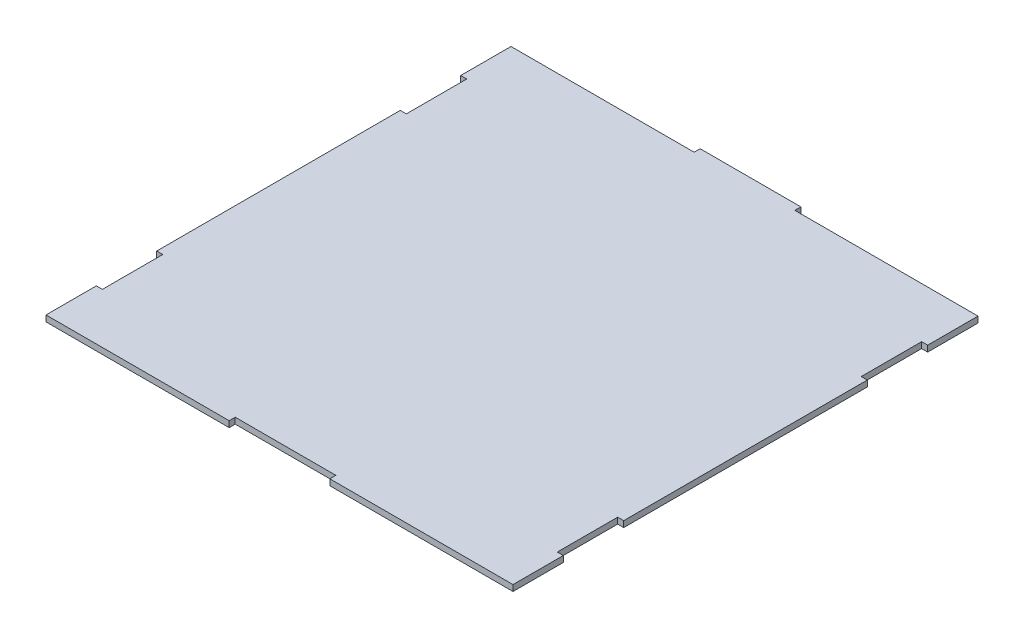
ISO-10303-21;
HEADER;
FILE_DESCRIPTION(('STEP AP214'),'2;1');
FILE_NAME('part.step','',(''),(''),'','','');
FILE_SCHEMA(('AUTOMOTIVE_DESIGN { 1 0 10303 214 1 1 1 1 }'));
ENDSEC;
DATA;
#1=APPLICATION_CONTEXT('core data for automotive mechanical design processes');
#2=APPLICATION_PROTOCOL_DEFINITION('international standard','automotive_design',2000,#1);
#3=PRODUCT_CONTEXT('',#1,'mechanical');
#4=PRODUCT('Part','Part','',(#3));
#5=PRODUCT_RELATED_PRODUCT_CATEGORY('part','',(#4));
#6=PRODUCT_DEFINITION_FORMATION('','',#4);
#7=PRODUCT_DEFINITION_CONTEXT('part definition',#1,'design');
#8=PRODUCT_DEFINITION('design','',#6,#7);
#9=PRODUCT_DEFINITION_SHAPE('','',#8);
#10=(LENGTH_UNIT() NAMED_UNIT(*) SI_UNIT(.MILLI.,.METRE.));
#11=(NAMED_UNIT(*) PLANE_ANGLE_UNIT() SI_UNIT($,.RADIAN.));
#12=(NAMED_UNIT(*) SI_UNIT($,.STERADIAN.) SOLID_ANGLE_UNIT());
#13=UNCERTAINTY_MEASURE_WITH_UNIT(LENGTH_MEASURE(1.E-05),#10,'distance_accuracy_value','');
#14=(GEOMETRIC_REPRESENTATION_CONTEXT(3) GLOBAL_UNCERTAINTY_ASSIGNED_CONTEXT((#13)) GLOBAL_UNIT_ASSIGNED_CONTEXT((#10,
#11,#12)) REPRESENTATION_CONTEXT('',''));
#15=CARTESIAN_POINT('',(0.,0.,0.));
#16=DIRECTION('',(0.,0.,1.));
#17=DIRECTION('',(1.,0.,0.));
#18=AXIS2_PLACEMENT_3D('',#15,#16,#17);
#19=CARTESIAN_POINT('',(91.0000000000001,3.,0.));
#20=DIRECTION('',(0.,0.,-1.));
#21=DIRECTION('',(-1.,0.,0.));
#22=AXIS2_PLACEMENT_3D('',#19,#20,#21);
#23=PLANE('',#22);
#24=DIRECTION('',(1.,0.,0.));
#25=VECTOR('',#24,1.);
#26=CARTESIAN_POINT('',(91.0000000000001,0.,0.));
#27=LINE('',#26,#25);
#28=CARTESIAN_POINT('',(0.,0.,0.));
#29=VERTEX_POINT('',#28);
#30=CARTESIAN_POINT('',(91.0000000000001,0.,0.));
#31=VERTEX_POINT('',#30);
#32=EDGE_CURVE('E260',#29,#31,#27,.T.);
#33=ORIENTED_EDGE('',*,*,#32,.T.);
#34=DIRECTION('',(0.,-1.,0.));
#35=VECTOR('',#34,1.);
#36=CARTESIAN_POINT('',(91.0000000000001,3.,0.));
#37=LINE('',#36,#35);
#38=CARTESIAN_POINT('',(91.0000000000001,3.,0.));
#39=VERTEX_POINT('',#38);
#40=EDGE_CURVE('E11',#39,#31,#37,.T.);
#41=ORIENTED_EDGE('',*,*,#40,.F.);
#42=DIRECTION('',(1.,0.,0.));
#43=VECTOR('',#42,1.);
#44=CARTESIAN_POINT('',(91.0000000000001,3.,0.));
#45=LINE('',#44,#43);
#46=CARTESIAN_POINT('',(0.,3.,0.));
#47=VERTEX_POINT('',#46);
#48=EDGE_CURVE('E342',#47,#39,#45,.T.);
#49=ORIENTED_EDGE('',*,*,#48,.F.);
#50=DIRECTION('',(0.,-1.,0.));
#51=VECTOR('',#50,1.);
#52=CARTESIAN_POINT('',(0.,3.,0.));
#53=LINE('',#52,#51);
#54=EDGE_CURVE('E256',#47,#29,#53,.T.);
#55=ORIENTED_EDGE('',*,*,#54,.T.);
#56=EDGE_LOOP('',(#33,#41,#49,#55));
#57=FACE_BOUND('',#56,.T.);
#58=ADVANCED_FACE('F39',(#57),#23,.F.);
#59=CARTESIAN_POINT('',(91.0000000000001,3.,-3.));
#60=DIRECTION('',(-1.,0.,0.));
#61=DIRECTION('',(0.,0.,1.));
#62=AXIS2_PLACEMENT_3D('',#59,#60,#61);
#63=PLANE('',#62);
#64=DIRECTION('',(0.,0.,-1.));
#65=VECTOR('',#64,1.);
#66=CARTESIAN_POINT('',(91.0000000000001,0.,-3.));
#67=LINE('',#66,#65);
#68=CARTESIAN_POINT('',(91.0000000000001,0.,-3.));
#69=VERTEX_POINT('',#68);
#70=EDGE_CURVE('E264',#31,#69,#67,.T.);
#71=ORIENTED_EDGE('',*,*,#70,.T.);
#72=DIRECTION('',(0.,-1.,0.));
#73=VECTOR('',#72,1.);
#74=CARTESIAN_POINT('',(91.0000000000001,3.,-3.));
#75=LINE('',#74,#73);
#76=CARTESIAN_POINT('',(91.0000000000001,3.,-3.));
#77=VERTEX_POINT('',#76);
#78=EDGE_CURVE('E48',#77,#69,#75,.T.);
#79=ORIENTED_EDGE('',*,*,#78,.F.);
#80=DIRECTION('',(0.,0.,-1.));
#81=VECTOR('',#80,1.);
#82=CARTESIAN_POINT('',(91.0000000000001,3.,-3.));
#83=LINE('',#82,#81);
#84=EDGE_CURVE('E159',#39,#77,#83,.T.);
#85=ORIENTED_EDGE('',*,*,#84,.F.);
#86=ORIENTED_EDGE('',*,*,#40,.T.);
#87=EDGE_LOOP('',(#71,#79,#85,#86));
#88=FACE_BOUND('',#87,.T.);
#89=ADVANCED_FACE('F548',(#88),#63,.F.);
#90=CARTESIAN_POINT('',(141.,3.,-3.));
#91=DIRECTION('',(0.,0.,-1.));
#92=DIRECTION('',(-1.,0.,0.));
#93=AXIS2_PLACEMENT_3D('',#90,#91,#92);
#94=PLANE('',#93);
#95=DIRECTION('',(1.,0.,0.));
#96=VECTOR('',#95,1.);
#97=CARTESIAN_POINT('',(141.,0.,-3.));
#98=LINE('',#97,#96);
#99=CARTESIAN_POINT('',(141.,0.,-3.));
#100=VERTEX_POINT('',#99);
#101=EDGE_CURVE('E267',#69,#100,#98,.T.);
#102=ORIENTED_EDGE('',*,*,#101,.T.);
#103=DIRECTION('',(0.,-1.,0.));
#104=VECTOR('',#103,1.);
#105=CARTESIAN_POINT('',(141.,3.,-3.));
#106=LINE('',#105,#104);
#107=CARTESIAN_POINT('',(141.,3.,-3.));
#108=VERTEX_POINT('',#107);
#109=EDGE_CURVE('E433',#108,#100,#106,.T.);
#110=ORIENTED_EDGE('',*,*,#109,.F.);
#111=DIRECTION('',(1.,0.,0.));
#112=VECTOR('',#111,1.);
#113=CARTESIAN_POINT('',(141.,3.,-3.));
#114=LINE('',#113,#112);
#115=EDGE_CURVE('E443',#77,#108,#114,.T.);
#116=ORIENTED_EDGE('',*,*,#115,.F.);
#117=ORIENTED_EDGE('',*,*,#78,.T.);
#118=EDGE_LOOP('',(#102,#110,#116,#117));
#119=FACE_BOUND('',#118,.T.);
#120=ADVANCED_FACE('F441',(#119),#94,.F.);
#121=CARTESIAN_POINT('',(141.,3.,0.));
#122=DIRECTION('',(1.,0.,0.));
#123=DIRECTION('',(0.,0.,-1.));
#124=AXIS2_PLACEMENT_3D('',#121,#122,#123);
#125=PLANE('',#124);
#126=DIRECTION('',(0.,0.,1.));
#127=VECTOR('',#126,1.);
#128=CARTESIAN_POINT('',(141.,0.,0.));
#129=LINE('',#128,#127);
#130=CARTESIAN_POINT('',(141.,0.,0.));
#131=VERTEX_POINT('',#130);
#132=EDGE_CURVE('E270',#100,#131,#129,.T.);
#133=ORIENTED_EDGE('',*,*,#132,.T.);
#134=DIRECTION('',(0.,-1.,0.));
#135=VECTOR('',#134,1.);
#136=CARTESIAN_POINT('',(141.,3.,0.));
#137=LINE('',#136,#135);
#138=CARTESIAN_POINT('',(141.,3.,0.));
#139=VERTEX_POINT('',#138);
#140=EDGE_CURVE('E429',#139,#131,#137,.T.);
#141=ORIENTED_EDGE('',*,*,#140,.F.);
#142=DIRECTION('',(0.,0.,1.));
#143=VECTOR('',#142,1.);
#144=CARTESIAN_POINT('',(141.,3.,0.));
#145=LINE('',#144,#143);
#146=EDGE_CURVE('E462',#108,#139,#145,.T.);
#147=ORIENTED_EDGE('',*,*,#146,.F.);
#148=ORIENTED_EDGE('',*,*,#109,.T.);
#149=EDGE_LOOP('',(#133,#141,#147,#148));
#150=FACE_BOUND('',#149,.T.);
#151=ADVANCED_FACE('F452',(#150),#125,.F.);
#152=CARTESIAN_POINT('',(232.,3.,0.));
#153=DIRECTION('',(0.,0.,-1.));
#154=DIRECTION('',(-1.,0.,0.));
#155=AXIS2_PLACEMENT_3D('',#152,#153,#154);
#156=PLANE('',#155);
#157=DIRECTION('',(1.,0.,0.));
#158=VECTOR('',#157,1.);
#159=CARTESIAN_POINT('',(232.,0.,0.));
#160=LINE('',#159,#158);
#161=CARTESIAN_POINT('',(232.,0.,0.));
#162=VERTEX_POINT('',#161);
#163=EDGE_CURVE('E273',#131,#162,#160,.T.);
#164=ORIENTED_EDGE('',*,*,#163,.T.);
#165=DIRECTION('',(0.,-1.,0.));
#166=VECTOR('',#165,1.);
#167=CARTESIAN_POINT('',(232.,3.,0.));
#168=LINE('',#167,#166);
#169=CARTESIAN_POINT('',(232.,3.,0.));
#170=VERTEX_POINT('',#169);
#171=EDGE_CURVE('E425',#170,#162,#168,.T.);
#172=ORIENTED_EDGE('',*,*,#171,.F.);
#173=DIRECTION('',(1.,0.,0.));
#174=VECTOR('',#173,1.);
#175=CARTESIAN_POINT('',(232.,3.,0.));
#176=LINE('',#175,#174);
#177=EDGE_CURVE('E458',#139,#170,#176,.T.);
#178=ORIENTED_EDGE('',*,*,#177,.F.);
#179=ORIENTED_EDGE('',*,*,#140,.T.);
#180=EDGE_LOOP('',(#164,#172,#178,#179));
#181=FACE_BOUND('',#180,.T.);
#182=ADVANCED_FACE('F456',(#181),#156,.F.);
#183=CARTESIAN_POINT('',(232.,3.,-25.));
#184=DIRECTION('',(-1.,0.,0.));
#185=DIRECTION('',(0.,0.,1.));
#186=AXIS2_PLACEMENT_3D('',#183,#184,#185);
#187=PLANE('',#186);
#188=DIRECTION('',(0.,0.,-1.));
#189=VECTOR('',#188,1.);
#190=CARTESIAN_POINT('',(232.,0.,-25.));
#191=LINE('',#190,#189);
#192=CARTESIAN_POINT('',(232.,0.,-25.));
#193=VERTEX_POINT('',#192);
#194=EDGE_CURVE('E276',#162,#193,#191,.T.);
#195=ORIENTED_EDGE('',*,*,#194,.T.);
#196=DIRECTION('',(0.,-1.,0.));
#197=VECTOR('',#196,1.);
#198=CARTESIAN_POINT('',(232.,3.,-25.));
#199=LINE('',#198,#197);
#200=CARTESIAN_POINT('',(232.,3.,-25.));
#201=VERTEX_POINT('',#200);
#202=EDGE_CURVE('E421',#201,#193,#199,.T.);
#203=ORIENTED_EDGE('',*,*,#202,.F.);
#204=DIRECTION('',(0.,0.,-1.));
#205=VECTOR('',#204,1.);
#206=CARTESIAN_POINT('',(232.,3.,-25.));
#207=LINE('',#206,#205);
#208=EDGE_CURVE('E461',#170,#201,#207,.T.);
#209=ORIENTED_EDGE('',*,*,#208,.F.);
#210=ORIENTED_EDGE('',*,*,#171,.T.);
#211=EDGE_LOOP('',(#195,#203,#209,#210));
#212=FACE_BOUND('',#211,.T.);
#213=ADVANCED_FACE('F561',(#212),#187,.F.);
#214=CARTESIAN_POINT('',(232.,3.,-25.));
#215=DIRECTION('',(0.,0.,1.));
#216=DIRECTION('',(1.,0.,0.));
#217=AXIS2_PLACEMENT_3D('',#214,#215,#216);
#218=PLANE('',#217);
#219=DIRECTION('',(-1.,0.,0.));
#220=VECTOR('',#219,1.);
#221=CARTESIAN_POINT('',(232.,0.,-25.));
#222=LINE('',#221,#220);
#223=CARTESIAN_POINT('',(229.,0.,-25.));
#224=VERTEX_POINT('',#223);
#225=EDGE_CURVE('E279',#193,#224,#222,.T.);
#226=ORIENTED_EDGE('',*,*,#225,.T.);
#227=DIRECTION('',(0.,-1.,0.));
#228=VECTOR('',#227,1.);
#229=CARTESIAN_POINT('',(229.,3.,-25.));
#230=LINE('',#229,#228);
#231=CARTESIAN_POINT('',(229.,3.,-25.));
#232=VERTEX_POINT('',#231);
#233=EDGE_CURVE('E417',#232,#224,#230,.T.);
#234=ORIENTED_EDGE('',*,*,#233,.F.);
#235=DIRECTION('',(-1.,0.,0.));
#236=VECTOR('',#235,1.);
#237=CARTESIAN_POINT('',(232.,3.,-25.));
#238=LINE('',#237,#236);
#239=EDGE_CURVE('E466',#201,#232,#238,.T.);
#240=ORIENTED_EDGE('',*,*,#239,.F.);
#241=ORIENTED_EDGE('',*,*,#202,.T.);
#242=EDGE_LOOP('',(#226,#234,#240,#241));
#243=FACE_BOUND('',#242,.T.);
#244=ADVANCED_FACE('F564',(#243),#218,.F.);
#245=CARTESIAN_POINT('',(229.,3.,-25.));
#246=DIRECTION('',(-1.,0.,0.));
#247=DIRECTION('',(0.,0.,1.));
#248=AXIS2_PLACEMENT_3D('',#245,#246,#247);
#249=PLANE('',#248);
#250=DIRECTION('',(0.,0.,-1.));
#251=VECTOR('',#250,1.);
#252=CARTESIAN_POINT('',(229.,0.,-25.));
#253=LINE('',#252,#251);
#254=CARTESIAN_POINT('',(229.,0.,-55.));
#255=VERTEX_POINT('',#254);
#256=EDGE_CURVE('E282',#224,#255,#253,.T.);
#257=ORIENTED_EDGE('',*,*,#256,.T.);
#258=DIRECTION('',(0.,-1.,0.));
#259=VECTOR('',#258,1.);
#260=CARTESIAN_POINT('',(229.,3.,-55.));
#261=LINE('',#260,#259);
#262=CARTESIAN_POINT('',(229.,3.,-55.));
#263=VERTEX_POINT('',#262);
#264=EDGE_CURVE('E413',#263,#255,#261,.T.);
#265=ORIENTED_EDGE('',*,*,#264,.F.);
#266=DIRECTION('',(0.,0.,-1.));
#267=VECTOR('',#266,1.);
#268=CARTESIAN_POINT('',(229.,3.,-25.));
#269=LINE('',#268,#267);
#270=EDGE_CURVE('E473',#232,#263,#269,.T.);
#271=ORIENTED_EDGE('',*,*,#270,.F.);
#272=ORIENTED_EDGE('',*,*,#233,.T.);
#273=EDGE_LOOP('',(#257,#265,#271,#272));
#274=FACE_BOUND('',#273,.T.);
#275=ADVANCED_FACE('F568',(#274),#249,.F.);
#276=CARTESIAN_POINT('',(232.,3.,-55.));
#277=DIRECTION('',(0.,0.,-1.));
#278=DIRECTION('',(-1.,0.,0.));
#279=AXIS2_PLACEMENT_3D('',#276,#277,#278);
#280=PLANE('',#279);
#281=DIRECTION('',(1.,0.,0.));
#282=VECTOR('',#281,1.);
#283=CARTESIAN_POINT('',(232.,0.,-55.));
#284=LINE('',#283,#282);
#285=CARTESIAN_POINT('',(232.,0.,-55.));
#286=VERTEX_POINT('',#285);
#287=EDGE_CURVE('E285',#255,#286,#284,.T.);
#288=ORIENTED_EDGE('',*,*,#287,.T.);
#289=DIRECTION('',(0.,-1.,0.));
#290=VECTOR('',#289,1.);
#291=CARTESIAN_POINT('',(232.,3.,-55.));
#292=LINE('',#291,#290);
#293=CARTESIAN_POINT('',(232.,3.,-55.));
#294=VERTEX_POINT('',#293);
#295=EDGE_CURVE('E409',#294,#286,#292,.T.);
#296=ORIENTED_EDGE('',*,*,#295,.F.);
#297=DIRECTION('',(1.,0.,0.));
#298=VECTOR('',#297,1.);
#299=CARTESIAN_POINT('',(232.,3.,-55.));
#300=LINE('',#299,#298);
#301=EDGE_CURVE('E476',#263,#294,#300,.T.);
#302=ORIENTED_EDGE('',*,*,#301,.F.);
#303=ORIENTED_EDGE('',*,*,#264,.T.);
#304=EDGE_LOOP('',(#288,#296,#302,#303));
#305=FACE_BOUND('',#304,.T.);
#306=ADVANCED_FACE('F572',(#305),#280,.F.);
#307=CARTESIAN_POINT('',(232.,3.,-176.));
#308=DIRECTION('',(-1.,0.,0.));
#309=DIRECTION('',(0.,0.,1.));
#310=AXIS2_PLACEMENT_3D('',#307,#308,#309);
#311=PLANE('',#310);
#312=DIRECTION('',(0.,0.,-1.));
#313=VECTOR('',#312,1.);
#314=CARTESIAN_POINT('',(232.,0.,-176.));
#315=LINE('',#314,#313);
#316=CARTESIAN_POINT('',(232.,0.,-176.));
#317=VERTEX_POINT('',#316);
#318=EDGE_CURVE('E288',#286,#317,#315,.T.);
#319=ORIENTED_EDGE('',*,*,#318,.T.);
#320=DIRECTION('',(0.,-1.,0.));
#321=VECTOR('',#320,1.);
#322=CARTESIAN_POINT('',(232.,3.,-176.));
#323=LINE('',#322,#321);
#324=CARTESIAN_POINT('',(232.,3.,-176.));
#325=VERTEX_POINT('',#324);
#326=EDGE_CURVE('E405',#325,#317,#323,.T.);
#327=ORIENTED_EDGE('',*,*,#326,.F.);
#328=DIRECTION('',(0.,0.,-1.));
#329=VECTOR('',#328,1.);
#330=CARTESIAN_POINT('',(232.,3.,-176.));
#331=LINE('',#330,#329);
#332=EDGE_CURVE('E479',#294,#325,#331,.T.);
#333=ORIENTED_EDGE('',*,*,#332,.F.);
#334=ORIENTED_EDGE('',*,*,#295,.T.);
#335=EDGE_LOOP('',(#319,#327,#333,#334));
#336=FACE_BOUND('',#335,.T.);
#337=ADVANCED_FACE('F576',(#336),#311,.F.);
#338=CARTESIAN_POINT('',(232.,3.,-176.));
#339=DIRECTION('',(0.,0.,1.));
#340=DIRECTION('',(1.,0.,0.));
#341=AXIS2_PLACEMENT_3D('',#338,#339,#340);
#342=PLANE('',#341);
#343=DIRECTION('',(-1.,0.,0.));
#344=VECTOR('',#343,1.);
#345=CARTESIAN_POINT('',(232.,0.,-176.));
#346=LINE('',#345,#344);
#347=CARTESIAN_POINT('',(229.,0.,-176.));
#348=VERTEX_POINT('',#347);
#349=EDGE_CURVE('E291',#317,#348,#346,.T.);
#350=ORIENTED_EDGE('',*,*,#349,.T.);
#351=DIRECTION('',(0.,-1.,0.));
#352=VECTOR('',#351,1.);
#353=CARTESIAN_POINT('',(229.,3.,-176.));
#354=LINE('',#353,#352);
#355=CARTESIAN_POINT('',(229.,3.,-176.));
#356=VERTEX_POINT('',#355);
#357=EDGE_CURVE('E401',#356,#348,#354,.T.);
#358=ORIENTED_EDGE('',*,*,#357,.F.);
#359=DIRECTION('',(-1.,0.,0.));
#360=VECTOR('',#359,1.);
#361=CARTESIAN_POINT('',(232.,3.,-176.));
#362=LINE('',#361,#360);
#363=EDGE_CURVE('E482',#325,#356,#362,.T.);
#364=ORIENTED_EDGE('',*,*,#363,.F.);
#365=ORIENTED_EDGE('',*,*,#326,.T.);
#366=EDGE_LOOP('',(#350,#358,#364,#365));
#367=FACE_BOUND('',#366,.T.);
#368=ADVANCED_FACE('F580',(#367),#342,.F.);
#369=CARTESIAN_POINT('',(229.,3.,-176.));
#370=DIRECTION('',(-1.,0.,0.));
#371=DIRECTION('',(0.,0.,1.));
#372=AXIS2_PLACEMENT_3D('',#369,#370,#371);
#373=PLANE('',#372);
#374=DIRECTION('',(0.,0.,-1.));
#375=VECTOR('',#374,1.);
#376=CARTESIAN_POINT('',(229.,0.,-176.));
#377=LINE('',#376,#375);
#378=CARTESIAN_POINT('',(229.,0.,-206.));
#379=VERTEX_POINT('',#378);
#380=EDGE_CURVE('E294',#348,#379,#377,.T.);
#381=ORIENTED_EDGE('',*,*,#380,.T.);
#382=DIRECTION('',(0.,-1.,0.));
#383=VECTOR('',#382,1.);
#384=CARTESIAN_POINT('',(229.,3.,-206.));
#385=LINE('',#384,#383);
#386=CARTESIAN_POINT('',(229.,3.,-206.));
#387=VERTEX_POINT('',#386);
#388=EDGE_CURVE('E397',#387,#379,#385,.T.);
#389=ORIENTED_EDGE('',*,*,#388,.F.);
#390=DIRECTION('',(0.,0.,-1.));
#391=VECTOR('',#390,1.);
#392=CARTESIAN_POINT('',(229.,3.,-176.));
#393=LINE('',#392,#391);
#394=EDGE_CURVE('E485',#356,#387,#393,.T.);
#395=ORIENTED_EDGE('',*,*,#394,.F.);
#396=ORIENTED_EDGE('',*,*,#357,.T.);
#397=EDGE_LOOP('',(#381,#389,#395,#396));
#398=FACE_BOUND('',#397,.T.);
#399=ADVANCED_FACE('F584',(#398),#373,.F.);
#400=CARTESIAN_POINT('',(232.,3.,-206.));
#401=DIRECTION('',(0.,0.,-1.));
#402=DIRECTION('',(-1.,0.,0.));
#403=AXIS2_PLACEMENT_3D('',#400,#401,#402);
#404=PLANE('',#403);
#405=DIRECTION('',(1.,0.,0.));
#406=VECTOR('',#405,1.);
#407=CARTESIAN_POINT('',(232.,0.,-206.));
#408=LINE('',#407,#406);
#409=CARTESIAN_POINT('',(232.,0.,-206.));
#410=VERTEX_POINT('',#409);
#411=EDGE_CURVE('E297',#379,#410,#408,.T.);
#412=ORIENTED_EDGE('',*,*,#411,.T.);
#413=DIRECTION('',(0.,-1.,0.));
#414=VECTOR('',#413,1.);
#415=CARTESIAN_POINT('',(232.,3.,-206.));
#416=LINE('',#415,#414);
#417=CARTESIAN_POINT('',(232.,3.,-206.));
#418=VERTEX_POINT('',#417);
#419=EDGE_CURVE('E393',#418,#410,#416,.T.);
#420=ORIENTED_EDGE('',*,*,#419,.F.);
#421=DIRECTION('',(1.,0.,0.));
#422=VECTOR('',#421,1.);
#423=CARTESIAN_POINT('',(232.,3.,-206.));
#424=LINE('',#423,#422);
#425=EDGE_CURVE('E488',#387,#418,#424,.T.);
#426=ORIENTED_EDGE('',*,*,#425,.F.);
#427=ORIENTED_EDGE('',*,*,#388,.T.);
#428=EDGE_LOOP('',(#412,#420,#426,#427));
#429=FACE_BOUND('',#428,.T.);
#430=ADVANCED_FACE('F588',(#429),#404,.F.);
#431=CARTESIAN_POINT('',(232.,3.,-231.));
#432=DIRECTION('',(-1.,0.,0.));
#433=DIRECTION('',(0.,0.,1.));
#434=AXIS2_PLACEMENT_3D('',#431,#432,#433);
#435=PLANE('',#434);
#436=DIRECTION('',(0.,0.,-1.));
#437=VECTOR('',#436,1.);
#438=CARTESIAN_POINT('',(232.,0.,-231.));
#439=LINE('',#438,#437);
#440=CARTESIAN_POINT('',(232.,0.,-231.));
#441=VERTEX_POINT('',#440);
#442=EDGE_CURVE('E300',#410,#441,#439,.T.);
#443=ORIENTED_EDGE('',*,*,#442,.T.);
#444=DIRECTION('',(0.,-1.,0.));
#445=VECTOR('',#444,1.);
#446=CARTESIAN_POINT('',(232.,3.,-231.));
#447=LINE('',#446,#445);
#448=CARTESIAN_POINT('',(232.,3.,-231.));
#449=VERTEX_POINT('',#448);
#450=EDGE_CURVE('E389',#449,#441,#447,.T.);
#451=ORIENTED_EDGE('',*,*,#450,.F.);
#452=DIRECTION('',(0.,0.,-1.));
#453=VECTOR('',#452,1.);
#454=CARTESIAN_POINT('',(232.,3.,-231.));
#455=LINE('',#454,#453);
#456=EDGE_CURVE('E491',#418,#449,#455,.T.);
#457=ORIENTED_EDGE('',*,*,#456,.F.);
#458=ORIENTED_EDGE('',*,*,#419,.T.);
#459=EDGE_LOOP('',(#443,#451,#457,#458));
#460=FACE_BOUND('',#459,.T.);
#461=ADVANCED_FACE('F592',(#460),#435,.F.);
#462=CARTESIAN_POINT('',(141.,3.,-231.));
#463=DIRECTION('',(0.,0.,1.));
#464=DIRECTION('',(1.,0.,0.));
#465=AXIS2_PLACEMENT_3D('',#462,#463,#464);
#466=PLANE('',#465);
#467=DIRECTION('',(-1.,0.,0.));
#468=VECTOR('',#467,1.);
#469=CARTESIAN_POINT('',(141.,0.,-231.));
#470=LINE('',#469,#468);
#471=CARTESIAN_POINT('',(141.,0.,-231.));
#472=VERTEX_POINT('',#471);
#473=EDGE_CURVE('E303',#441,#472,#470,.T.);
#474=ORIENTED_EDGE('',*,*,#473,.T.);
#475=DIRECTION('',(0.,-1.,0.));
#476=VECTOR('',#475,1.);
#477=CARTESIAN_POINT('',(141.,3.,-231.));
#478=LINE('',#477,#476);
#479=CARTESIAN_POINT('',(141.,3.,-231.));
#480=VERTEX_POINT('',#479);
#481=EDGE_CURVE('E385',#480,#472,#478,.T.);
#482=ORIENTED_EDGE('',*,*,#481,.F.);
#483=DIRECTION('',(-1.,0.,0.));
#484=VECTOR('',#483,1.);
#485=CARTESIAN_POINT('',(141.,3.,-231.));
#486=LINE('',#485,#484);
#487=EDGE_CURVE('E494',#449,#480,#486,.T.);
#488=ORIENTED_EDGE('',*,*,#487,.F.);
#489=ORIENTED_EDGE('',*,*,#450,.T.);
#490=EDGE_LOOP('',(#474,#482,#488,#489));
#491=FACE_BOUND('',#490,.T.);
#492=ADVANCED_FACE('F596',(#491),#466,.F.);
#493=CARTESIAN_POINT('',(141.,3.,-234.));
#494=DIRECTION('',(-1.,0.,0.));
#495=DIRECTION('',(0.,0.,1.));
#496=AXIS2_PLACEMENT_3D('',#493,#494,#495);
#497=PLANE('',#496);
#498=DIRECTION('',(0.,0.,-1.));
#499=VECTOR('',#498,1.);
#500=CARTESIAN_POINT('',(141.,0.,-234.));
#501=LINE('',#500,#499);
#502=CARTESIAN_POINT('',(141.,0.,-234.));
#503=VERTEX_POINT('',#502);
#504=EDGE_CURVE('E306',#472,#503,#501,.T.);
#505=ORIENTED_EDGE('',*,*,#504,.T.);
#506=DIRECTION('',(0.,-1.,0.));
#507=VECTOR('',#506,1.);
#508=CARTESIAN_POINT('',(141.,3.,-234.));
#509=LINE('',#508,#507);
#510=CARTESIAN_POINT('',(141.,3.,-234.));
#511=VERTEX_POINT('',#510);
#512=EDGE_CURVE('E381',#511,#503,#509,.T.);
#513=ORIENTED_EDGE('',*,*,#512,.F.);
#514=DIRECTION('',(0.,0.,-1.));
#515=VECTOR('',#514,1.);
#516=CARTESIAN_POINT('',(141.,3.,-234.));
#517=LINE('',#516,#515);
#518=EDGE_CURVE('E497',#480,#511,#517,.T.);
#519=ORIENTED_EDGE('',*,*,#518,.F.);
#520=ORIENTED_EDGE('',*,*,#481,.T.);
#521=EDGE_LOOP('',(#505,#513,#519,#520));
#522=FACE_BOUND('',#521,.T.);
#523=ADVANCED_FACE('F600',(#522),#497,.F.);
#524=CARTESIAN_POINT('',(91.,3.,-234.));
#525=DIRECTION('',(0.,0.,1.));
#526=DIRECTION('',(1.,0.,0.));
#527=AXIS2_PLACEMENT_3D('',#524,#525,#526);
#528=PLANE('',#527);
#529=DIRECTION('',(-1.,0.,0.));
#530=VECTOR('',#529,1.);
#531=CARTESIAN_POINT('',(91.,0.,-234.));
#532=LINE('',#531,#530);
#533=CARTESIAN_POINT('',(91.,0.,-234.));
#534=VERTEX_POINT('',#533);
#535=EDGE_CURVE('E309',#503,#534,#532,.T.);
#536=ORIENTED_EDGE('',*,*,#535,.T.);
#537=DIRECTION('',(0.,-1.,0.));
#538=VECTOR('',#537,1.);
#539=CARTESIAN_POINT('',(91.,3.,-234.));
#540=LINE('',#539,#538);
#541=CARTESIAN_POINT('',(91.,3.,-234.));
#542=VERTEX_POINT('',#541);
#543=EDGE_CURVE('E377',#542,#534,#540,.T.);
#544=ORIENTED_EDGE('',*,*,#543,.F.);
#545=DIRECTION('',(-1.,0.,0.));
#546=VECTOR('',#545,1.);
#547=CARTESIAN_POINT('',(91.,3.,-234.));
#548=LINE('',#547,#546);
#549=EDGE_CURVE('E500',#511,#542,#548,.T.);
#550=ORIENTED_EDGE('',*,*,#549,.F.);
#551=ORIENTED_EDGE('',*,*,#512,.T.);
#552=EDGE_LOOP('',(#536,#544,#550,#551));
#553=FACE_BOUND('',#552,.T.);
#554=ADVANCED_FACE('F604',(#553),#528,.F.);
#555=CARTESIAN_POINT('',(91.,3.,-231.));
#556=DIRECTION('',(1.,0.,0.));
#557=DIRECTION('',(0.,0.,-1.));
#558=AXIS2_PLACEMENT_3D('',#555,#556,#557);
#559=PLANE('',#558);
#560=DIRECTION('',(0.,0.,1.));
#561=VECTOR('',#560,1.);
#562=CARTESIAN_POINT('',(91.,0.,-231.));
#563=LINE('',#562,#561);
#564=CARTESIAN_POINT('',(91.,0.,-231.));
#565=VERTEX_POINT('',#564);
#566=EDGE_CURVE('E312',#534,#565,#563,.T.);
#567=ORIENTED_EDGE('',*,*,#566,.T.);
#568=DIRECTION('',(0.,-1.,0.));
#569=VECTOR('',#568,1.);
#570=CARTESIAN_POINT('',(91.,3.,-231.));
#571=LINE('',#570,#569);
#572=CARTESIAN_POINT('',(91.,3.,-231.));
#573=VERTEX_POINT('',#572);
#574=EDGE_CURVE('E373',#573,#565,#571,.T.);
#575=ORIENTED_EDGE('',*,*,#574,.F.);
#576=DIRECTION('',(0.,0.,1.));
#577=VECTOR('',#576,1.);
#578=CARTESIAN_POINT('',(91.,3.,-231.));
#579=LINE('',#578,#577);
#580=EDGE_CURVE('E503',#542,#573,#579,.T.);
#581=ORIENTED_EDGE('',*,*,#580,.F.);
#582=ORIENTED_EDGE('',*,*,#543,.T.);
#583=EDGE_LOOP('',(#567,#575,#581,#582));
#584=FACE_BOUND('',#583,.T.);
#585=ADVANCED_FACE('F608',(#584),#559,.F.);
#586=CARTESIAN_POINT('',(0.,3.,-231.));
#587=DIRECTION('',(0.,0.,1.));
#588=DIRECTION('',(1.,0.,0.));
#589=AXIS2_PLACEMENT_3D('',#586,#587,#588);
#590=PLANE('',#589);
#591=DIRECTION('',(-1.,0.,0.));
#592=VECTOR('',#591,1.);
#593=CARTESIAN_POINT('',(0.,0.,-231.));
#594=LINE('',#593,#592);
#595=CARTESIAN_POINT('',(0.,0.,-231.));
#596=VERTEX_POINT('',#595);
#597=EDGE_CURVE('E315',#565,#596,#594,.T.);
#598=ORIENTED_EDGE('',*,*,#597,.T.);
#599=DIRECTION('',(0.,-1.,0.));
#600=VECTOR('',#599,1.);
#601=CARTESIAN_POINT('',(0.,3.,-231.));
#602=LINE('',#601,#600);
#603=CARTESIAN_POINT('',(0.,3.,-231.));
#604=VERTEX_POINT('',#603);
#605=EDGE_CURVE('E369',#604,#596,#602,.T.);
#606=ORIENTED_EDGE('',*,*,#605,.F.);
#607=DIRECTION('',(-1.,0.,0.));
#608=VECTOR('',#607,1.);
#609=CARTESIAN_POINT('',(0.,3.,-231.));
#610=LINE('',#609,#608);
#611=EDGE_CURVE('E506',#573,#604,#610,.T.);
#612=ORIENTED_EDGE('',*,*,#611,.F.);
#613=ORIENTED_EDGE('',*,*,#574,.T.);
#614=EDGE_LOOP('',(#598,#606,#612,#613));
#615=FACE_BOUND('',#614,.T.);
#616=ADVANCED_FACE('F612',(#615),#590,.F.);
#617=CARTESIAN_POINT('',(0.,3.,-206.));
#618=DIRECTION('',(1.,0.,0.));
#619=DIRECTION('',(0.,0.,-1.));
#620=AXIS2_PLACEMENT_3D('',#617,#618,#619);
#621=PLANE('',#620);
#622=DIRECTION('',(0.,0.,1.));
#623=VECTOR('',#622,1.);
#624=CARTESIAN_POINT('',(0.,0.,-206.));
#625=LINE('',#624,#623);
#626=CARTESIAN_POINT('',(0.,0.,-206.));
#627=VERTEX_POINT('',#626);
#628=EDGE_CURVE('E318',#596,#627,#625,.T.);
#629=ORIENTED_EDGE('',*,*,#628,.T.);
#630=DIRECTION('',(0.,-1.,0.));
#631=VECTOR('',#630,1.);
#632=CARTESIAN_POINT('',(0.,3.,-206.));
#633=LINE('',#632,#631);
#634=CARTESIAN_POINT('',(0.,3.,-206.));
#635=VERTEX_POINT('',#634);
#636=EDGE_CURVE('E365',#635,#627,#633,.T.);
#637=ORIENTED_EDGE('',*,*,#636,.F.);
#638=DIRECTION('',(0.,0.,1.));
#639=VECTOR('',#638,1.);
#640=CARTESIAN_POINT('',(0.,3.,-206.));
#641=LINE('',#640,#639);
#642=EDGE_CURVE('E509',#604,#635,#641,.T.);
#643=ORIENTED_EDGE('',*,*,#642,.F.);
#644=ORIENTED_EDGE('',*,*,#605,.T.);
#645=EDGE_LOOP('',(#629,#637,#643,#644));
#646=FACE_BOUND('',#645,.T.);
#647=ADVANCED_FACE('F616',(#646),#621,.F.);
#648=CARTESIAN_POINT('',(0.,3.,-206.));
#649=DIRECTION('',(0.,0.,-1.));
#650=DIRECTION('',(-1.,0.,0.));
#651=AXIS2_PLACEMENT_3D('',#648,#649,#650);
#652=PLANE('',#651);
#653=DIRECTION('',(1.,0.,0.));
#654=VECTOR('',#653,1.);
#655=CARTESIAN_POINT('',(0.,0.,-206.));
#656=LINE('',#655,#654);
#657=CARTESIAN_POINT('',(3.,0.,-206.));
#658=VERTEX_POINT('',#657);
#659=EDGE_CURVE('E321',#627,#658,#656,.T.);
#660=ORIENTED_EDGE('',*,*,#659,.T.);
#661=DIRECTION('',(0.,-1.,0.));
#662=VECTOR('',#661,1.);
#663=CARTESIAN_POINT('',(3.,3.,-206.));
#664=LINE('',#663,#662);
#665=CARTESIAN_POINT('',(3.,3.,-206.));
#666=VERTEX_POINT('',#665);
#667=EDGE_CURVE('E361',#666,#658,#664,.T.);
#668=ORIENTED_EDGE('',*,*,#667,.F.);
#669=DIRECTION('',(1.,0.,0.));
#670=VECTOR('',#669,1.);
#671=CARTESIAN_POINT('',(0.,3.,-206.));
#672=LINE('',#671,#670);
#673=EDGE_CURVE('E512',#635,#666,#672,.T.);
#674=ORIENTED_EDGE('',*,*,#673,.F.);
#675=ORIENTED_EDGE('',*,*,#636,.T.);
#676=EDGE_LOOP('',(#660,#668,#674,#675));
#677=FACE_BOUND('',#676,.T.);
#678=ADVANCED_FACE('F620',(#677),#652,.F.);
#679=CARTESIAN_POINT('',(3.,3.,-206.));
#680=DIRECTION('',(1.,0.,0.));
#681=DIRECTION('',(0.,0.,-1.));
#682=AXIS2_PLACEMENT_3D('',#679,#680,#681);
#683=PLANE('',#682);
#684=DIRECTION('',(0.,0.,1.));
#685=VECTOR('',#684,1.);
#686=CARTESIAN_POINT('',(3.,0.,-206.));
#687=LINE('',#686,#685);
#688=CARTESIAN_POINT('',(3.,0.,-176.));
#689=VERTEX_POINT('',#688);
#690=EDGE_CURVE('E324',#658,#689,#687,.T.);
#691=ORIENTED_EDGE('',*,*,#690,.T.);
#692=DIRECTION('',(0.,-1.,0.));
#693=VECTOR('',#692,1.);
#694=CARTESIAN_POINT('',(3.,3.,-176.));
#695=LINE('',#694,#693);
#696=CARTESIAN_POINT('',(3.,3.,-176.));
#697=VERTEX_POINT('',#696);
#698=EDGE_CURVE('E357',#697,#689,#695,.T.);
#699=ORIENTED_EDGE('',*,*,#698,.F.);
#700=DIRECTION('',(0.,0.,1.));
#701=VECTOR('',#700,1.);
#702=CARTESIAN_POINT('',(3.,3.,-206.));
#703=LINE('',#702,#701);
#704=EDGE_CURVE('E515',#666,#697,#703,.T.);
#705=ORIENTED_EDGE('',*,*,#704,.F.);
#706=ORIENTED_EDGE('',*,*,#667,.T.);
#707=EDGE_LOOP('',(#691,#699,#705,#706));
#708=FACE_BOUND('',#707,.T.);
#709=ADVANCED_FACE('F624',(#708),#683,.F.);
#710=CARTESIAN_POINT('',(0.,3.,-176.));
#711=DIRECTION('',(0.,0.,1.));
#712=DIRECTION('',(1.,0.,0.));
#713=AXIS2_PLACEMENT_3D('',#710,#711,#712);
#714=PLANE('',#713);
#715=DIRECTION('',(-1.,0.,0.));
#716=VECTOR('',#715,1.);
#717=CARTESIAN_POINT('',(0.,0.,-176.));
#718=LINE('',#717,#716);
#719=CARTESIAN_POINT('',(0.,0.,-176.));
#720=VERTEX_POINT('',#719);
#721=EDGE_CURVE('E327',#689,#720,#718,.T.);
#722=ORIENTED_EDGE('',*,*,#721,.T.);
#723=DIRECTION('',(0.,-1.,0.));
#724=VECTOR('',#723,1.);
#725=CARTESIAN_POINT('',(0.,3.,-176.));
#726=LINE('',#725,#724);
#727=CARTESIAN_POINT('',(0.,3.,-176.));
#728=VERTEX_POINT('',#727);
#729=EDGE_CURVE('E353',#728,#720,#726,.T.);
#730=ORIENTED_EDGE('',*,*,#729,.F.);
#731=DIRECTION('',(-1.,0.,0.));
#732=VECTOR('',#731,1.);
#733=CARTESIAN_POINT('',(0.,3.,-176.));
#734=LINE('',#733,#732);
#735=EDGE_CURVE('E518',#697,#728,#734,.T.);
#736=ORIENTED_EDGE('',*,*,#735,.F.);
#737=ORIENTED_EDGE('',*,*,#698,.T.);
#738=EDGE_LOOP('',(#722,#730,#736,#737));
#739=FACE_BOUND('',#738,.T.);
#740=ADVANCED_FACE('F628',(#739),#714,.F.);
#741=CARTESIAN_POINT('',(0.,3.,-55.));
#742=DIRECTION('',(1.,0.,0.));
#743=DIRECTION('',(0.,0.,-1.));
#744=AXIS2_PLACEMENT_3D('',#741,#742,#743);
#745=PLANE('',#744);
#746=DIRECTION('',(0.,0.,1.));
#747=VECTOR('',#746,1.);
#748=CARTESIAN_POINT('',(0.,0.,-55.));
#749=LINE('',#748,#747);
#750=CARTESIAN_POINT('',(0.,0.,-55.));
#751=VERTEX_POINT('',#750);
#752=EDGE_CURVE('E330',#720,#751,#749,.T.);
#753=ORIENTED_EDGE('',*,*,#752,.T.);
#754=DIRECTION('',(0.,-1.,0.));
#755=VECTOR('',#754,1.);
#756=CARTESIAN_POINT('',(0.,3.,-55.));
#757=LINE('',#756,#755);
#758=CARTESIAN_POINT('',(0.,3.,-55.));
#759=VERTEX_POINT('',#758);
#760=EDGE_CURVE('E349',#759,#751,#757,.T.);
#761=ORIENTED_EDGE('',*,*,#760,.F.);
#762=DIRECTION('',(0.,0.,1.));
#763=VECTOR('',#762,1.);
#764=CARTESIAN_POINT('',(0.,3.,-55.));
#765=LINE('',#764,#763);
#766=EDGE_CURVE('E521',#728,#759,#765,.T.);
#767=ORIENTED_EDGE('',*,*,#766,.F.);
#768=ORIENTED_EDGE('',*,*,#729,.T.);
#769=EDGE_LOOP('',(#753,#761,#767,#768));
#770=FACE_BOUND('',#769,.T.);
#771=ADVANCED_FACE('F529',(#770),#745,.F.);
#772=CARTESIAN_POINT('',(0.,3.,-55.));
#773=DIRECTION('',(0.,0.,-1.));
#774=DIRECTION('',(-1.,0.,0.));
#775=AXIS2_PLACEMENT_3D('',#772,#773,#774);
#776=PLANE('',#775);
#777=DIRECTION('',(1.,0.,0.));
#778=VECTOR('',#777,1.);
#779=CARTESIAN_POINT('',(0.,0.,-55.));
#780=LINE('',#779,#778);
#781=CARTESIAN_POINT('',(3.,0.,-55.));
#782=VERTEX_POINT('',#781);
#783=EDGE_CURVE('E333',#751,#782,#780,.T.);
#784=ORIENTED_EDGE('',*,*,#783,.T.);
#785=DIRECTION('',(0.,-1.,0.));
#786=VECTOR('',#785,1.);
#787=CARTESIAN_POINT('',(3.,3.,-55.));
#788=LINE('',#787,#786);
#789=CARTESIAN_POINT('',(3.,3.,-55.));
#790=VERTEX_POINT('',#789);
#791=EDGE_CURVE('E249',#790,#782,#788,.T.);
#792=ORIENTED_EDGE('',*,*,#791,.F.);
#793=DIRECTION('',(1.,0.,0.));
#794=VECTOR('',#793,1.);
#795=CARTESIAN_POINT('',(0.,3.,-55.));
#796=LINE('',#795,#794);
#797=EDGE_CURVE('E238',#759,#790,#796,.T.);
#798=ORIENTED_EDGE('',*,*,#797,.F.);
#799=ORIENTED_EDGE('',*,*,#760,.T.);
#800=EDGE_LOOP('',(#784,#792,#798,#799));
#801=FACE_BOUND('',#800,.T.);
#802=ADVANCED_FACE('F533',(#801),#776,.F.);
#803=CARTESIAN_POINT('',(3.,3.,-25.));
#804=DIRECTION('',(1.,0.,0.));
#805=DIRECTION('',(0.,0.,-1.));
#806=AXIS2_PLACEMENT_3D('',#803,#804,#805);
#807=PLANE('',#806);
#808=DIRECTION('',(0.,0.,1.));
#809=VECTOR('',#808,1.);
#810=CARTESIAN_POINT('',(3.,0.,-25.));
#811=LINE('',#810,#809);
#812=CARTESIAN_POINT('',(3.,0.,-25.));
#813=VERTEX_POINT('',#812);
#814=EDGE_CURVE('E247',#782,#813,#811,.T.);
#815=ORIENTED_EDGE('',*,*,#814,.T.);
#816=DIRECTION('',(0.,-1.,0.));
#817=VECTOR('',#816,1.);
#818=CARTESIAN_POINT('',(3.,3.,-25.));
#819=LINE('',#818,#817);
#820=CARTESIAN_POINT('',(3.,3.,-25.));
#821=VERTEX_POINT('',#820);
#822=EDGE_CURVE('E244',#821,#813,#819,.T.);
#823=ORIENTED_EDGE('',*,*,#822,.F.);
#824=DIRECTION('',(0.,0.,1.));
#825=VECTOR('',#824,1.);
#826=CARTESIAN_POINT('',(3.,3.,-25.));
#827=LINE('',#826,#825);
#828=EDGE_CURVE('E232',#790,#821,#827,.T.);
#829=ORIENTED_EDGE('',*,*,#828,.F.);
#830=ORIENTED_EDGE('',*,*,#791,.T.);
#831=EDGE_LOOP('',(#815,#823,#829,#830));
#832=FACE_BOUND('',#831,.T.);
#833=ADVANCED_FACE('F245',(#832),#807,.F.);
#834=CARTESIAN_POINT('',(0.,3.,-25.));
#835=DIRECTION('',(0.,0.,1.));
#836=DIRECTION('',(1.,0.,0.));
#837=AXIS2_PLACEMENT_3D('',#834,#835,#836);
#838=PLANE('',#837);
#839=DIRECTION('',(-1.,0.,0.));
#840=VECTOR('',#839,1.);
#841=CARTESIAN_POINT('',(0.,0.,-25.));
#842=LINE('',#841,#840);
#843=CARTESIAN_POINT('',(0.,0.,-25.));
#844=VERTEX_POINT('',#843);
#845=EDGE_CURVE('E145',#813,#844,#842,.T.);
#846=ORIENTED_EDGE('',*,*,#845,.T.);
#847=DIRECTION('',(0.,-1.,0.));
#848=VECTOR('',#847,1.);
#849=CARTESIAN_POINT('',(0.,3.,-25.));
#850=LINE('',#849,#848);
#851=CARTESIAN_POINT('',(0.,3.,-25.));
#852=VERTEX_POINT('',#851);
#853=EDGE_CURVE('E250',#852,#844,#850,.T.);
#854=ORIENTED_EDGE('',*,*,#853,.F.);
#855=DIRECTION('',(-1.,0.,0.));
#856=VECTOR('',#855,1.);
#857=CARTESIAN_POINT('',(0.,3.,-25.));
#858=LINE('',#857,#856);
#859=EDGE_CURVE('E236',#821,#852,#858,.T.);
#860=ORIENTED_EDGE('',*,*,#859,.F.);
#861=ORIENTED_EDGE('',*,*,#822,.T.);
#862=EDGE_LOOP('',(#846,#854,#860,#861));
#863=FACE_BOUND('',#862,.T.);
#864=ADVANCED_FACE('F252',(#863),#838,.F.);
#865=CARTESIAN_POINT('',(0.,3.,0.));
#866=DIRECTION('',(1.,0.,0.));
#867=DIRECTION('',(0.,0.,-1.));
#868=AXIS2_PLACEMENT_3D('',#865,#866,#867);
#869=PLANE('',#868);
#870=DIRECTION('',(0.,0.,1.));
#871=VECTOR('',#870,1.);
#872=CARTESIAN_POINT('',(0.,0.,0.));
#873=LINE('',#872,#871);
#874=EDGE_CURVE('E151',#844,#29,#873,.T.);
#875=ORIENTED_EDGE('',*,*,#874,.T.);
#876=ORIENTED_EDGE('',*,*,#54,.F.);
#877=DIRECTION('',(0.,0.,1.));
#878=VECTOR('',#877,1.);
#879=CARTESIAN_POINT('',(0.,3.,0.));
#880=LINE('',#879,#878);
#881=EDGE_CURVE('E56',#852,#47,#880,.T.);
#882=ORIENTED_EDGE('',*,*,#881,.F.);
#883=ORIENTED_EDGE('',*,*,#853,.T.);
#884=EDGE_LOOP('',(#875,#876,#882,#883));
#885=FACE_BOUND('',#884,.T.);
#886=ADVANCED_FACE('F537',(#885),#869,.F.);
#887=CARTESIAN_POINT('',(0.,3.,0.));
#888=DIRECTION('',(0.,-1.,0.));
#889=DIRECTION('',(0.,0.,-1.));
#890=AXIS2_PLACEMENT_3D('',#887,#888,#889);
#891=PLANE('',#890);
#892=ORIENTED_EDGE('',*,*,#48,.T.);
#893=ORIENTED_EDGE('',*,*,#84,.T.);
#894=ORIENTED_EDGE('',*,*,#115,.T.);
#895=ORIENTED_EDGE('',*,*,#146,.T.);
#896=ORIENTED_EDGE('',*,*,#177,.T.);
#897=ORIENTED_EDGE('',*,*,#208,.T.);
#898=ORIENTED_EDGE('',*,*,#239,.T.);
#899=ORIENTED_EDGE('',*,*,#270,.T.);
#900=ORIENTED_EDGE('',*,*,#301,.T.);
#901=ORIENTED_EDGE('',*,*,#332,.T.);
#902=ORIENTED_EDGE('',*,*,#363,.T.);
#903=ORIENTED_EDGE('',*,*,#394,.T.);
#904=ORIENTED_EDGE('',*,*,#425,.T.);
#905=ORIENTED_EDGE('',*,*,#456,.T.);
#906=ORIENTED_EDGE('',*,*,#487,.T.);
#907=ORIENTED_EDGE('',*,*,#518,.T.);
#908=ORIENTED_EDGE('',*,*,#549,.T.);
#909=ORIENTED_EDGE('',*,*,#580,.T.);
#910=ORIENTED_EDGE('',*,*,#611,.T.);
#911=ORIENTED_EDGE('',*,*,#642,.T.);
#912=ORIENTED_EDGE('',*,*,#673,.T.);
#913=ORIENTED_EDGE('',*,*,#704,.T.);
#914=ORIENTED_EDGE('',*,*,#735,.T.);
#915=ORIENTED_EDGE('',*,*,#766,.T.);
#916=ORIENTED_EDGE('',*,*,#797,.T.);
#917=ORIENTED_EDGE('',*,*,#828,.T.);
#918=ORIENTED_EDGE('',*,*,#859,.T.);
#919=ORIENTED_EDGE('',*,*,#881,.T.);
#920=EDGE_LOOP('',(#892,#893,#894,#895,#896,#897,#898,#899,#900,#901,#902,#903,#904,#905,#906,
#907,#908,#909,#910,#911,#912,#913,#914,#915,#916,#917,#918,#919));
#921=FACE_BOUND('',#920,.T.);
#922=ADVANCED_FACE('F234',(#921),#891,.F.);
#923=CARTESIAN_POINT('',(0.,0.,0.));
#924=DIRECTION('',(0.,-1.,0.));
#925=DIRECTION('',(0.,0.,-1.));
#926=AXIS2_PLACEMENT_3D('',#923,#924,#925);
#927=PLANE('',#926);
#928=ORIENTED_EDGE('',*,*,#32,.F.);
#929=ORIENTED_EDGE('',*,*,#874,.F.);
#930=ORIENTED_EDGE('',*,*,#845,.F.);
#931=ORIENTED_EDGE('',*,*,#814,.F.);
#932=ORIENTED_EDGE('',*,*,#783,.F.);
#933=ORIENTED_EDGE('',*,*,#752,.F.);
#934=ORIENTED_EDGE('',*,*,#721,.F.);
#935=ORIENTED_EDGE('',*,*,#690,.F.);
#936=ORIENTED_EDGE('',*,*,#659,.F.);
#937=ORIENTED_EDGE('',*,*,#628,.F.);
#938=ORIENTED_EDGE('',*,*,#597,.F.);
#939=ORIENTED_EDGE('',*,*,#566,.F.);
#940=ORIENTED_EDGE('',*,*,#535,.F.);
#941=ORIENTED_EDGE('',*,*,#504,.F.);
#942=ORIENTED_EDGE('',*,*,#473,.F.);
#943=ORIENTED_EDGE('',*,*,#442,.F.);
#944=ORIENTED_EDGE('',*,*,#411,.F.);
#945=ORIENTED_EDGE('',*,*,#380,.F.);
#946=ORIENTED_EDGE('',*,*,#349,.F.);
#947=ORIENTED_EDGE('',*,*,#318,.F.);
#948=ORIENTED_EDGE('',*,*,#287,.F.);
#949=ORIENTED_EDGE('',*,*,#256,.F.);
#950=ORIENTED_EDGE('',*,*,#225,.F.);
#951=ORIENTED_EDGE('',*,*,#194,.F.);
#952=ORIENTED_EDGE('',*,*,#163,.F.);
#953=ORIENTED_EDGE('',*,*,#132,.F.);
#954=ORIENTED_EDGE('',*,*,#101,.F.);
#955=ORIENTED_EDGE('',*,*,#70,.F.);
#956=EDGE_LOOP('',(#928,#929,#930,#931,#932,#933,#934,#935,#936,#937,#938,#939,#940,#941,#942,
#943,#944,#945,#946,#947,#948,#949,#950,#951,#952,#953,#954,#955));
#957=FACE_BOUND('',#956,.T.);
#958=ADVANCED_FACE('F447',(#957),#927,.T.);
#959=CLOSED_SHELL('',(#58,#89,#120,#151,#182,#213,#244,#275,#306,#337,#368,#399,#430,#461,#492,
#523,#554,#585,#616,#647,#678,#709,#740,#771,#802,#833,#864,#886,#922,#958));
#960=MANIFOLD_SOLID_BREP('B2',#959);
#961=ADVANCED_BREP_SHAPE_REPRESENTATION('',(#18,#960),#14);
#962=SHAPE_DEFINITION_REPRESENTATION(#9,#961);
ENDSEC;
END-ISO-10303-21;
